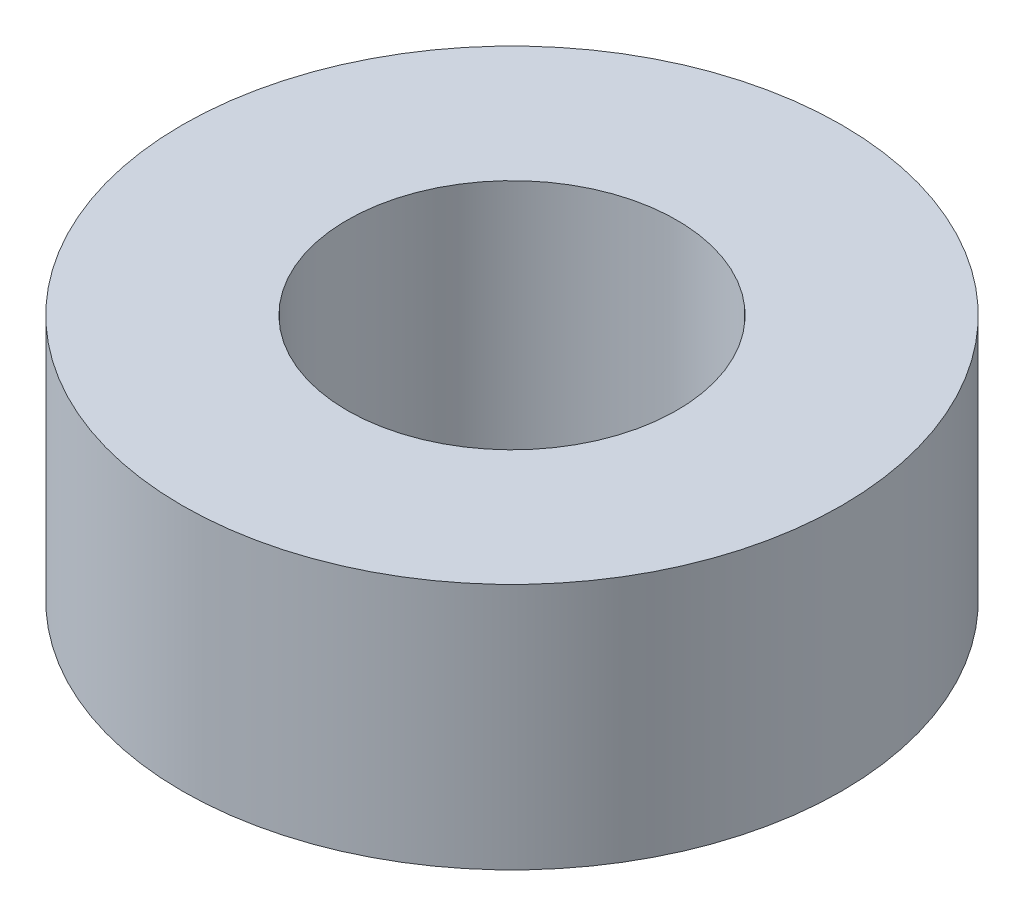
ISO-10303-21;
HEADER;
FILE_DESCRIPTION(('STEP AP214'),'2;1');
FILE_NAME('part.step','',(''),(''),'','','');
FILE_SCHEMA(('AUTOMOTIVE_DESIGN { 1 0 10303 214 1 1 1 1 }'));
ENDSEC;
DATA;
#1=APPLICATION_CONTEXT('core data for automotive mechanical design processes');
#2=APPLICATION_PROTOCOL_DEFINITION('international standard','automotive_design',2000,#1);
#3=PRODUCT_CONTEXT('',#1,'mechanical');
#4=PRODUCT('Part','Part','',(#3));
#5=PRODUCT_RELATED_PRODUCT_CATEGORY('part','',(#4));
#6=PRODUCT_DEFINITION_FORMATION('','',#4);
#7=PRODUCT_DEFINITION_CONTEXT('part definition',#1,'design');
#8=PRODUCT_DEFINITION('design','',#6,#7);
#9=PRODUCT_DEFINITION_SHAPE('','',#8);
#10=(LENGTH_UNIT() NAMED_UNIT(*) SI_UNIT(.MILLI.,.METRE.));
#11=(NAMED_UNIT(*) PLANE_ANGLE_UNIT() SI_UNIT($,.RADIAN.));
#12=(NAMED_UNIT(*) SI_UNIT($,.STERADIAN.) SOLID_ANGLE_UNIT());
#13=UNCERTAINTY_MEASURE_WITH_UNIT(LENGTH_MEASURE(1.E-05),#10,'distance_accuracy_value','');
#14=(GEOMETRIC_REPRESENTATION_CONTEXT(3) GLOBAL_UNCERTAINTY_ASSIGNED_CONTEXT((#13)) GLOBAL_UNIT_ASSIGNED_CONTEXT((#10,
#11,#12)) REPRESENTATION_CONTEXT('',''));
#15=CARTESIAN_POINT('',(0.,0.,0.));
#16=DIRECTION('',(0.,0.,1.));
#17=DIRECTION('',(1.,0.,0.));
#18=AXIS2_PLACEMENT_3D('',#15,#16,#17);
#19=CARTESIAN_POINT('',(0.,3.,0.));
#20=DIRECTION('',(0.,1.,0.));
#21=DIRECTION('',(0.,0.,1.));
#22=AXIS2_PLACEMENT_3D('',#19,#20,#21);
#23=PLANE('',#22);
#24=CARTESIAN_POINT('',(0.,3.,0.));
#25=DIRECTION('',(0.,1.,0.));
#26=DIRECTION('',(0.,0.,1.));
#27=AXIS2_PLACEMENT_3D('',#24,#25,#26);
#28=CIRCLE('',#27,4.);
#29=CARTESIAN_POINT('',(0.,3.,4.));
#30=VERTEX_POINT('',#29);
#31=EDGE_CURVE('E10',#30,#30,#28,.T.);
#32=ORIENTED_EDGE('',*,*,#31,.T.);
#33=EDGE_LOOP('',(#32));
#34=FACE_BOUND('',#33,.T.);
#35=CARTESIAN_POINT('',(0.,3.,0.));
#36=DIRECTION('',(0.,1.,0.));
#37=DIRECTION('',(0.,0.,1.));
#38=AXIS2_PLACEMENT_3D('',#35,#36,#37);
#39=CIRCLE('',#38,2.);
#40=CARTESIAN_POINT('',(0.,3.,2.));
#41=VERTEX_POINT('',#40);
#42=EDGE_CURVE('E40',#41,#41,#39,.T.);
#43=ORIENTED_EDGE('',*,*,#42,.F.);
#44=EDGE_LOOP('',(#43));
#45=FACE_BOUND('',#44,.T.);
#46=ADVANCED_FACE('F29',(#34,#45),#23,.T.);
#47=CARTESIAN_POINT('',(0.,0.,0.));
#48=DIRECTION('',(0.,1.,0.));
#49=DIRECTION('',(0.,0.,1.));
#50=AXIS2_PLACEMENT_3D('',#47,#48,#49);
#51=PLANE('',#50);
#52=CARTESIAN_POINT('',(0.,0.,0.));
#53=DIRECTION('',(0.,1.,0.));
#54=DIRECTION('',(0.,0.,1.));
#55=AXIS2_PLACEMENT_3D('',#52,#53,#54);
#56=CIRCLE('',#55,4.);
#57=CARTESIAN_POINT('',(0.,0.,4.));
#58=VERTEX_POINT('',#57);
#59=EDGE_CURVE('E33',#58,#58,#56,.T.);
#60=ORIENTED_EDGE('',*,*,#59,.F.);
#61=EDGE_LOOP('',(#60));
#62=FACE_BOUND('',#61,.T.);
#63=CARTESIAN_POINT('',(0.,0.,0.));
#64=DIRECTION('',(0.,1.,0.));
#65=DIRECTION('',(0.,0.,1.));
#66=AXIS2_PLACEMENT_3D('',#63,#64,#65);
#67=CIRCLE('',#66,2.);
#68=CARTESIAN_POINT('',(0.,0.,2.));
#69=VERTEX_POINT('',#68);
#70=EDGE_CURVE('E42',#69,#69,#67,.T.);
#71=ORIENTED_EDGE('',*,*,#70,.T.);
#72=EDGE_LOOP('',(#71));
#73=FACE_BOUND('',#72,.T.);
#74=ADVANCED_FACE('F52',(#62,#73),#51,.F.);
#75=CARTESIAN_POINT('',(0.,3.,0.));
#76=DIRECTION('',(0.,-1.,0.));
#77=DIRECTION('',(0.,0.,-1.));
#78=AXIS2_PLACEMENT_3D('',#75,#76,#77);
#79=CYLINDRICAL_SURFACE('',#78,4.);
#80=ORIENTED_EDGE('',*,*,#31,.F.);
#81=EDGE_LOOP('',(#80));
#82=FACE_BOUND('',#81,.T.);
#83=ORIENTED_EDGE('',*,*,#59,.T.);
#84=EDGE_LOOP('',(#83));
#85=FACE_BOUND('',#84,.T.);
#86=ADVANCED_FACE('F31',(#82,#85),#79,.T.);
#87=CARTESIAN_POINT('',(0.,3.,0.));
#88=DIRECTION('',(0.,-1.,0.));
#89=DIRECTION('',(0.,0.,-1.));
#90=AXIS2_PLACEMENT_3D('',#87,#88,#89);
#91=CYLINDRICAL_SURFACE('',#90,2.);
#92=ORIENTED_EDGE('',*,*,#42,.T.);
#93=EDGE_LOOP('',(#92));
#94=FACE_BOUND('',#93,.T.);
#95=ORIENTED_EDGE('',*,*,#70,.F.);
#96=EDGE_LOOP('',(#95));
#97=FACE_BOUND('',#96,.T.);
#98=ADVANCED_FACE('F48',(#94,#97),#91,.F.);
#99=CLOSED_SHELL('',(#46,#74,#86,#98));
#100=MANIFOLD_SOLID_BREP('B2',#99);
#101=ADVANCED_BREP_SHAPE_REPRESENTATION('',(#18,#100),#14);
#102=SHAPE_DEFINITION_REPRESENTATION(#9,#101);
ENDSEC;
END-ISO-10303-21;
